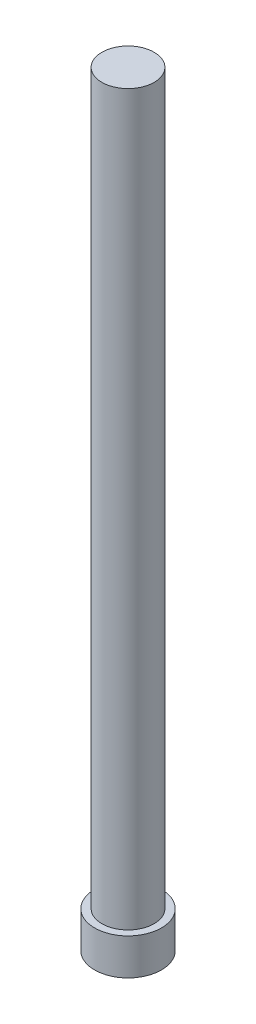
ISO-10303-21;
HEADER;
FILE_DESCRIPTION(('STEP AP214'),'2;1');
FILE_NAME('part.step','',(''),(''),'','','');
FILE_SCHEMA(('AUTOMOTIVE_DESIGN { 1 0 10303 214 1 1 1 1 }'));
ENDSEC;
DATA;
#1=APPLICATION_CONTEXT('core data for automotive mechanical design processes');
#2=APPLICATION_PROTOCOL_DEFINITION('international standard','automotive_design',2000,#1);
#3=PRODUCT_CONTEXT('',#1,'mechanical');
#4=PRODUCT('Part','Part','',(#3));
#5=PRODUCT_RELATED_PRODUCT_CATEGORY('part','',(#4));
#6=PRODUCT_DEFINITION_FORMATION('','',#4);
#7=PRODUCT_DEFINITION_CONTEXT('part definition',#1,'design');
#8=PRODUCT_DEFINITION('design','',#6,#7);
#9=PRODUCT_DEFINITION_SHAPE('','',#8);
#10=(LENGTH_UNIT() NAMED_UNIT(*) SI_UNIT(.MILLI.,.METRE.));
#11=(NAMED_UNIT(*) PLANE_ANGLE_UNIT() SI_UNIT($,.RADIAN.));
#12=(NAMED_UNIT(*) SI_UNIT($,.STERADIAN.) SOLID_ANGLE_UNIT());
#13=UNCERTAINTY_MEASURE_WITH_UNIT(LENGTH_MEASURE(1.E-05),#10,'distance_accuracy_value','');
#14=(GEOMETRIC_REPRESENTATION_CONTEXT(3) GLOBAL_UNCERTAINTY_ASSIGNED_CONTEXT((#13)) GLOBAL_UNIT_ASSIGNED_CONTEXT((#10,
#11,#12)) REPRESENTATION_CONTEXT('',''));
#15=CARTESIAN_POINT('',(0.,0.,0.));
#16=DIRECTION('',(0.,0.,1.));
#17=DIRECTION('',(1.,0.,0.));
#18=AXIS2_PLACEMENT_3D('',#15,#16,#17);
#19=CARTESIAN_POINT('',(0.,60.,0.));
#20=DIRECTION('',(0.,-1.,0.));
#21=DIRECTION('',(0.,0.,-1.));
#22=AXIS2_PLACEMENT_3D('',#19,#20,#21);
#23=CYLINDRICAL_SURFACE('',#22,2.15);
#24=CARTESIAN_POINT('',(0.,60.,0.));
#25=DIRECTION('',(0.,1.,0.));
#26=DIRECTION('',(0.,0.,1.));
#27=AXIS2_PLACEMENT_3D('',#24,#25,#26);
#28=CIRCLE('',#27,2.15);
#29=CARTESIAN_POINT('',(0.,60.,2.15));
#30=VERTEX_POINT('',#29);
#31=EDGE_CURVE('E10',#30,#30,#28,.T.);
#32=ORIENTED_EDGE('',*,*,#31,.F.);
#33=EDGE_LOOP('',(#32));
#34=FACE_BOUND('',#33,.T.);
#35=CARTESIAN_POINT('',(0.,0.,0.));
#36=DIRECTION('',(0.,-1.,0.));
#37=DIRECTION('',(0.,0.,-1.));
#38=AXIS2_PLACEMENT_3D('',#35,#36,#37);
#39=CIRCLE('',#38,2.15);
#40=CARTESIAN_POINT('',(0.,0.,-2.15));
#41=VERTEX_POINT('',#40);
#42=EDGE_CURVE('E39',#41,#41,#39,.T.);
#43=ORIENTED_EDGE('',*,*,#42,.F.);
#44=EDGE_LOOP('',(#43));
#45=FACE_BOUND('',#44,.T.);
#46=ADVANCED_FACE('F33',(#34,#45),#23,.T.);
#47=CARTESIAN_POINT('',(0.,60.,0.));
#48=DIRECTION('',(0.,1.,0.));
#49=DIRECTION('',(0.,0.,1.));
#50=AXIS2_PLACEMENT_3D('',#47,#48,#49);
#51=PLANE('',#50);
#52=ORIENTED_EDGE('',*,*,#31,.T.);
#53=EDGE_LOOP('',(#52));
#54=FACE_BOUND('',#53,.T.);
#55=ADVANCED_FACE('F57',(#54),#51,.T.);
#56=CARTESIAN_POINT('',(0.,0.,0.));
#57=DIRECTION('',(0.,-1.,0.));
#58=DIRECTION('',(0.,0.,-1.));
#59=AXIS2_PLACEMENT_3D('',#56,#57,#58);
#60=PLANE('',#59);
#61=CARTESIAN_POINT('',(0.,0.,0.));
#62=DIRECTION('',(0.,-1.,0.));
#63=DIRECTION('',(0.,0.,-1.));
#64=AXIS2_PLACEMENT_3D('',#61,#62,#63);
#65=CIRCLE('',#64,2.75);
#66=CARTESIAN_POINT('',(0.,0.,-2.75));
#67=VERTEX_POINT('',#66);
#68=EDGE_CURVE('E47',#67,#67,#65,.T.);
#69=ORIENTED_EDGE('',*,*,#68,.F.);
#70=EDGE_LOOP('',(#69));
#71=FACE_BOUND('',#70,.T.);
#72=ORIENTED_EDGE('',*,*,#42,.T.);
#73=EDGE_LOOP('',(#72));
#74=FACE_BOUND('',#73,.T.);
#75=ADVANCED_FACE('F55',(#71,#74),#60,.F.);
#76=CARTESIAN_POINT('',(0.,-3.,0.));
#77=DIRECTION('',(0.,1.,0.));
#78=DIRECTION('',(0.,0.,1.));
#79=AXIS2_PLACEMENT_3D('',#76,#77,#78);
#80=CYLINDRICAL_SURFACE('',#79,2.75);
#81=CARTESIAN_POINT('',(0.,-3.,0.));
#82=DIRECTION('',(0.,-1.,0.));
#83=DIRECTION('',(0.,0.,-1.));
#84=AXIS2_PLACEMENT_3D('',#81,#82,#83);
#85=CIRCLE('',#84,2.75);
#86=CARTESIAN_POINT('',(0.,-3.,-2.75));
#87=VERTEX_POINT('',#86);
#88=EDGE_CURVE('E43',#87,#87,#85,.T.);
#89=ORIENTED_EDGE('',*,*,#88,.F.);
#90=EDGE_LOOP('',(#89));
#91=FACE_BOUND('',#90,.T.);
#92=ORIENTED_EDGE('',*,*,#68,.T.);
#93=EDGE_LOOP('',(#92));
#94=FACE_BOUND('',#93,.T.);
#95=ADVANCED_FACE('F53',(#91,#94),#80,.T.);
#96=CARTESIAN_POINT('',(0.,-3.,0.));
#97=DIRECTION('',(0.,-1.,0.));
#98=DIRECTION('',(0.,0.,-1.));
#99=AXIS2_PLACEMENT_3D('',#96,#97,#98);
#100=PLANE('',#99);
#101=ORIENTED_EDGE('',*,*,#88,.T.);
#102=EDGE_LOOP('',(#101));
#103=FACE_BOUND('',#102,.T.);
#104=ADVANCED_FACE('F63',(#103),#100,.T.);
#105=CLOSED_SHELL('',(#46,#55,#75,#95,#104));
#106=MANIFOLD_SOLID_BREP('B2',#105);
#107=ADVANCED_BREP_SHAPE_REPRESENTATION('',(#18,#106),#14);
#108=SHAPE_DEFINITION_REPRESENTATION(#9,#107);
ENDSEC;
END-ISO-10303-21;
